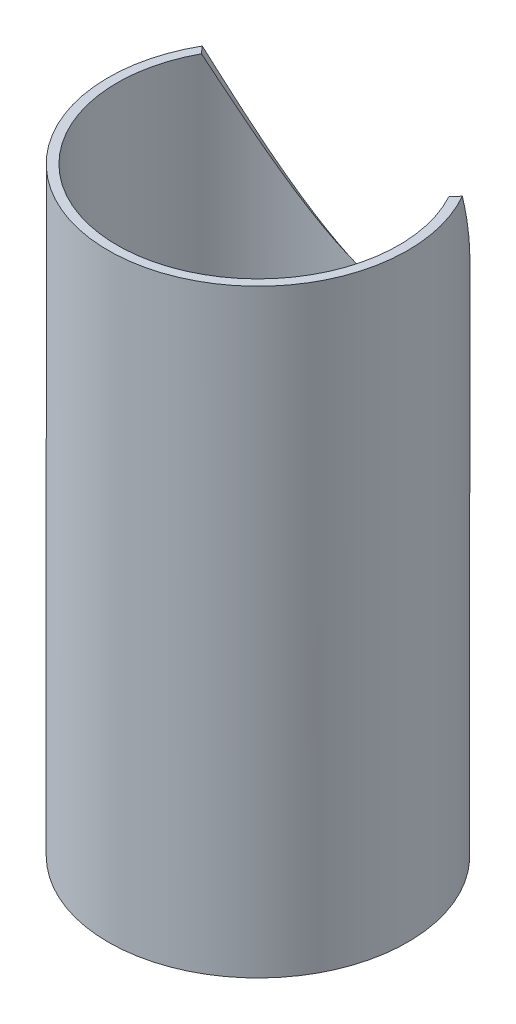
ISO-10303-21;
HEADER;
FILE_DESCRIPTION(('STEP AP214'),'2;1');
FILE_NAME('part.step','',(''),(''),'','','');
FILE_SCHEMA(('AUTOMOTIVE_DESIGN { 1 0 10303 214 1 1 1 1 }'));
ENDSEC;
DATA;
#1=APPLICATION_CONTEXT('core data for automotive mechanical design processes');
#2=APPLICATION_PROTOCOL_DEFINITION('international standard','automotive_design',2000,#1);
#3=PRODUCT_CONTEXT('',#1,'mechanical');
#4=PRODUCT('Part','Part','',(#3));
#5=PRODUCT_RELATED_PRODUCT_CATEGORY('part','',(#4));
#6=PRODUCT_DEFINITION_FORMATION('','',#4);
#7=PRODUCT_DEFINITION_CONTEXT('part definition',#1,'design');
#8=PRODUCT_DEFINITION('design','',#6,#7);
#9=PRODUCT_DEFINITION_SHAPE('','',#8);
#10=(LENGTH_UNIT() NAMED_UNIT(*) SI_UNIT(.MILLI.,.METRE.));
#11=(NAMED_UNIT(*) PLANE_ANGLE_UNIT() SI_UNIT($,.RADIAN.));
#12=(NAMED_UNIT(*) SI_UNIT($,.STERADIAN.) SOLID_ANGLE_UNIT());
#13=UNCERTAINTY_MEASURE_WITH_UNIT(LENGTH_MEASURE(1.E-05),#10,'distance_accuracy_value','');
#14=(GEOMETRIC_REPRESENTATION_CONTEXT(3) GLOBAL_UNCERTAINTY_ASSIGNED_CONTEXT((#13)) GLOBAL_UNIT_ASSIGNED_CONTEXT((#10,
#11,#12)) REPRESENTATION_CONTEXT('',''));
#15=CARTESIAN_POINT('',(0.,0.,0.));
#16=DIRECTION('',(0.,0.,1.));
#17=DIRECTION('',(1.,0.,0.));
#18=AXIS2_PLACEMENT_3D('',#15,#16,#17);
#19=CARTESIAN_POINT('',(0.,200.,0.));
#20=DIRECTION('',(0.,1.,0.));
#21=DIRECTION('',(0.,0.,1.00000000000001));
#22=AXIS2_PLACEMENT_3D('',#19,#20,#21);
#23=PLANE('',#22);
#24=CARTESIAN_POINT('',(0.,200.,-79.6979183351203));
#25=DIRECTION('',(0.,1.,0.));
#26=DIRECTION('',(0.,0.,-1.00000000000001));
#27=AXIS2_PLACEMENT_3D('',#24,#25,#26);
#28=ELLIPSE('',#27,76.2984117975911,62.5);
#29=CARTESIAN_POINT('',(-43.4115484470269,200.,-24.808012041102));
#30=VERTEX_POINT('',#29);
#31=CARTESIAN_POINT('',(-41.3011468451532,200.,-22.4324601699214));
#32=VERTEX_POINT('',#31);
#33=EDGE_CURVE('E105',#30,#32,#28,.T.);
#34=ORIENTED_EDGE('',*,*,#33,.F.);
#35=CARTESIAN_POINT('',(0.,200.,0.));
#36=DIRECTION('',(0.,1.,0.));
#37=DIRECTION('',(0.,0.,1.00000000000001));
#38=AXIS2_PLACEMENT_3D('',#35,#36,#37);
#39=CIRCLE('',#38,50.);
#40=CARTESIAN_POINT('',(43.4115484470269,200.,-24.808012041102));
#41=VERTEX_POINT('',#40);
#42=EDGE_CURVE('E100',#30,#41,#39,.T.);
#43=ORIENTED_EDGE('',*,*,#42,.T.);
#44=CARTESIAN_POINT('',(41.3011468451532,200.,-22.4324601699214));
#45=VERTEX_POINT('',#44);
#46=EDGE_CURVE('E114',#45,#41,#28,.T.);
#47=ORIENTED_EDGE('',*,*,#46,.F.);
#48=CARTESIAN_POINT('',(0.,200.,0.));
#49=DIRECTION('',(0.,1.,0.));
#50=DIRECTION('',(1.00000000000001,0.,0.));
#51=AXIS2_PLACEMENT_3D('',#48,#49,#50);
#52=CIRCLE('',#51,47.);
#53=EDGE_CURVE('E119',#32,#45,#52,.T.);
#54=ORIENTED_EDGE('',*,*,#53,.F.);
#55=EDGE_LOOP('',(#34,#43,#47,#54));
#56=FACE_BOUND('',#55,.T.);
#57=ADVANCED_FACE('F85',(#56),#23,.T.);
#58=CARTESIAN_POINT('',(0.,0.,0.));
#59=DIRECTION('',(0.,1.,0.));
#60=DIRECTION('',(0.,0.,1.00000000000001));
#61=AXIS2_PLACEMENT_3D('',#58,#59,#60);
#62=PLANE('',#61);
#63=CARTESIAN_POINT('',(0.,0.,0.));
#64=DIRECTION('',(0.,1.,0.));
#65=DIRECTION('',(0.,0.,1.00000000000001));
#66=AXIS2_PLACEMENT_3D('',#63,#64,#65);
#67=CIRCLE('',#66,50.);
#68=CARTESIAN_POINT('',(0.,0.,50.0000000000003));
#69=VERTEX_POINT('',#68);
#70=EDGE_CURVE('E124',#69,#69,#67,.T.);
#71=ORIENTED_EDGE('',*,*,#70,.F.);
#72=EDGE_LOOP('',(#71));
#73=FACE_BOUND('',#72,.T.);
#74=CARTESIAN_POINT('',(0.,0.,0.));
#75=DIRECTION('',(0.,1.,0.));
#76=DIRECTION('',(1.00000000000001,0.,0.));
#77=AXIS2_PLACEMENT_3D('',#74,#75,#76);
#78=CIRCLE('',#77,47.);
#79=CARTESIAN_POINT('',(47.0000000000003,0.,0.));
#80=VERTEX_POINT('',#79);
#81=EDGE_CURVE('E126',#80,#80,#78,.T.);
#82=ORIENTED_EDGE('',*,*,#81,.T.);
#83=EDGE_LOOP('',(#82));
#84=FACE_BOUND('',#83,.T.);
#85=ADVANCED_FACE('F143',(#73,#84),#62,.F.);
#86=CARTESIAN_POINT('',(0.,200.,0.));
#87=DIRECTION('',(0.,-1.,0.));
#88=DIRECTION('',(0.,0.,-1.00000000000001));
#89=AXIS2_PLACEMENT_3D('',#86,#87,#88);
#90=CYLINDRICAL_SURFACE('',#89,50.);
#91=ORIENTED_EDGE('',*,*,#42,.F.);
#92=CARTESIAN_POINT('',(-43.4115484470269,200.,-24.808012041102));
#93=CARTESIAN_POINT('',(-43.1882554393132,199.066140757275,-25.1987287377304));
#94=CARTESIAN_POINT('',(-42.9595070072669,198.132474550287,-25.586793609528));
#95=CARTESIAN_POINT('',(-42.4907849658919,196.265861335717,-26.3578654201332));
#96=CARTESIAN_POINT('',(-42.2508112529962,195.332914334851,-26.740872312233));
#97=CARTESIAN_POINT('',(-41.7592866971202,193.467931558747,-27.5021313140156));
#98=CARTESIAN_POINT('',(-41.50773389494,192.535895965167,-27.8803826051566));
#99=CARTESIAN_POINT('',(-40.9927025017648,190.673260710046,-28.632253100087));
#100=CARTESIAN_POINT('',(-40.7292239335742,189.742661045761,-29.0058723127322));
#101=CARTESIAN_POINT('',(-39.9173698181452,186.943620484037,-30.1240081424272));
#102=CARTESIAN_POINT('',(-39.3501851451642,185.077882892477,-30.8617502770765));
#103=CARTESIAN_POINT('',(-38.1614771975081,181.357105385439,-32.3200683169202));
#104=CARTESIAN_POINT('',(-37.5399572107515,179.502064829897,-33.0406452574554));
#105=CARTESIAN_POINT('',(-36.5553466550259,176.710218769315,-34.1167041750029));
#106=CARTESIAN_POINT('',(-36.2144900761371,175.767943410626,-34.4784246655062));
#107=CARTESIAN_POINT('',(-35.5160846540969,173.887904825823,-35.1974294653655));
#108=CARTESIAN_POINT('',(-35.1585361277089,172.950141514456,-35.5547138587427));
#109=CARTESIAN_POINT('',(-34.4256034784985,171.079710407259,-36.2648344221887));
#110=CARTESIAN_POINT('',(-34.0502164584583,170.147043466766,-36.6176698578293));
#111=CARTESIAN_POINT('',(-33.2804112339584,168.287834176211,-37.3186985581683));
#112=CARTESIAN_POINT('',(-32.8859931438043,167.361291789401,-37.6668918507327));
#113=CARTESIAN_POINT('',(-32.0775645361782,165.517364942004,-38.3576842732188));
#114=CARTESIAN_POINT('',(-31.6635985443464,164.599964934923,-38.7002939321283));
#115=CARTESIAN_POINT('',(-30.8136132332815,162.773479944601,-39.3804207706529));
#116=CARTESIAN_POINT('',(-30.3775933654769,161.864395168859,-39.7179378233222));
#117=CARTESIAN_POINT('',(-29.4817267795845,160.05634111586,-40.3873790525956));
#118=CARTESIAN_POINT('',(-29.0218877160263,159.157368700553,-40.7193049810768));
#119=CARTESIAN_POINT('',(-28.076036640401,157.371118462078,-41.3771446022524));
#120=CARTESIAN_POINT('',(-27.5900268465677,156.483839655669,-41.7030588013677));
#121=CARTESIAN_POINT('',(-26.8057584965309,155.10423866073,-42.2085919002712));
#122=CARTESIAN_POINT('',(-26.5172759533439,154.607176484242,-42.3904800203089));
#123=CARTESIAN_POINT('',(-25.9304763466678,153.618048912282,-42.751949347697));
#124=CARTESIAN_POINT('',(-25.6321594839941,153.125983415047,-42.9315306020493));
#125=CARTESIAN_POINT('',(-25.0250317472889,152.147326256315,-43.2882407764934));
#126=CARTESIAN_POINT('',(-24.716219028103,151.660735577504,-43.4653692576079));
#127=CARTESIAN_POINT('',(-24.0874868639714,150.693800360745,-43.816921564767));
#128=CARTESIAN_POINT('',(-23.7675673651563,150.213455853107,-43.9913453776876));
#129=CARTESIAN_POINT('',(-22.7905228442231,148.783569944436,-44.5099576647014));
#130=CARTESIAN_POINT('',(-22.1156531428,147.844431188567,-44.8497584297436));
#131=CARTESIAN_POINT('',(-20.7120897924734,146.001977643848,-45.5149716089889));
#132=CARTESIAN_POINT('',(-19.9834070420015,145.098655657887,-45.8403869153672));
#133=CARTESIAN_POINT('',(-18.6204669191977,143.519882479958,-46.4080265978448));
#134=CARTESIAN_POINT('',(-17.9976397779629,142.835794877963,-46.6535889947462));
#135=CARTESIAN_POINT('',(-16.7081120998314,141.504509448696,-47.1307955622664));
#136=CARTESIAN_POINT('',(-16.041402410791,140.857319369631,-47.3624368100957));
#137=CARTESIAN_POINT('',(-14.6611113857502,139.611688817277,-47.8077037226529));
#138=CARTESIAN_POINT('',(-13.9476492607085,139.013132452754,-48.0213722608563));
#139=CARTESIAN_POINT('',(-12.4680867359131,137.876728162056,-48.426587244586));
#140=CARTESIAN_POINT('',(-11.7020251665191,137.338836210702,-48.6181497352144));
#141=CARTESIAN_POINT('',(-10.4458656155274,136.549615195108,-48.8989590267108));
#142=CARTESIAN_POINT('',(-9.97405464165908,136.272391756595,-48.9975364486684));
#143=CARTESIAN_POINT('',(-9.01137664955539,135.748625407984,-49.1836908745227));
#144=CARTESIAN_POINT('',(-8.5205068773754,135.502086953591,-49.271266280856));
#145=CARTESIAN_POINT('',(-7.52065762906318,135.044469170473,-49.4337540646155));
#146=CARTESIAN_POINT('',(-7.01168648225139,134.833373782085,-49.5086721773049));
#147=CARTESIAN_POINT('',(-5.97719558195241,134.451417117686,-49.6441842762708));
#148=CARTESIAN_POINT('',(-5.45168430009001,134.280535612989,-49.7047854644135));
#149=CARTESIAN_POINT('',(-4.37984437718019,133.981677295152,-49.8107464151567));
#150=CARTESIAN_POINT('',(-3.83333778227954,133.854262558471,-49.8559065221845));
#151=CARTESIAN_POINT('',(-2.72980238466628,133.649453562329,-49.9284870028701));
#152=CARTESIAN_POINT('',(-2.17277395227277,133.57205754581,-49.9559079996682));
#153=CARTESIAN_POINT('',(-1.05375048291688,133.470108921017,-49.9920261479357));
#154=CARTESIAN_POINT('',(-0.491760223702882,133.445510085278,-50.000739679045));
#155=CARTESIAN_POINT('',(0.631952073452959,133.44996361477,-49.9991620522272));
#156=CARTESIAN_POINT('',(1.19367413189211,133.47901085398,-49.9888727100733));
#157=CARTESIAN_POINT('',(2.23250697361981,133.581825736919,-49.9524470008381));
#158=CARTESIAN_POINT('',(2.71040333468018,133.648726831928,-49.9287437742712));
#159=CARTESIAN_POINT('',(3.65861159747408,133.819494288165,-49.868228368193));
#160=CARTESIAN_POINT('',(4.12892446638006,133.923355895968,-49.8314178743833));
#161=CARTESIAN_POINT('',(5.05962305204867,134.165597017454,-49.7455402768813));
#162=CARTESIAN_POINT('',(5.52000376237366,134.303993516737,-49.6964671419292));
#163=CARTESIAN_POINT('',(6.42885423863219,134.612357594875,-49.5870903720206));
#164=CARTESIAN_POINT('',(6.87731811624116,134.782340461351,-49.5267812988977));
#165=CARTESIAN_POINT('',(7.97240488383146,135.238905670943,-49.3647316263352));
#166=CARTESIAN_POINT('',(8.61113883768006,135.542355873012,-49.256976426819));
#167=CARTESIAN_POINT('',(9.85756332585094,136.201463297243,-49.0227622839624));
#168=CARTESIAN_POINT('',(10.4652351689337,136.557151465824,-48.8962922533851));
#169=CARTESIAN_POINT('',(11.6505374011187,137.31246732524,-48.6275130722681));
#170=CARTESIAN_POINT('',(12.2281041556702,137.712182938698,-48.4851722205491));
#171=CARTESIAN_POINT('',(13.3529877673588,138.547315800412,-48.1875112844085));
#172=CARTESIAN_POINT('',(13.9003084569615,138.98272850806,-48.0321928506644));
#173=CARTESIAN_POINT('',(14.921153211929,139.844734277283,-47.7244027837899));
#174=CARTESIAN_POINT('',(15.3969920326946,140.268919121725,-47.5728156948189));
#175=CARTESIAN_POINT('',(16.3264697970649,141.138145135559,-47.2618929805358));
#176=CARTESIAN_POINT('',(16.7801095129778,141.583185578326,-47.1025576251714));
#177=CARTESIAN_POINT('',(17.6671185236541,142.491329698512,-46.7770912915047));
#178=CARTESIAN_POINT('',(18.1004710395944,142.954447766463,-46.6109548939478));
#179=CARTESIAN_POINT('',(18.94801895625,143.895812454947,-46.2728940197946));
#180=CARTESIAN_POINT('',(19.362214216173,144.374059186623,-46.1009695006758));
#181=CARTESIAN_POINT('',(20.1739195156467,145.344823043523,-45.7515978604922));
#182=CARTESIAN_POINT('',(20.5713825740639,145.837374537634,-45.5741373469089));
#183=CARTESIAN_POINT('',(21.3497536472812,146.833752088905,-45.2147294701179));
#184=CARTESIAN_POINT('',(21.7306618846716,147.337577994335,-45.0327821672896));
#185=CARTESIAN_POINT('',(22.4769601926966,148.354827437042,-44.6649666912834));
#186=CARTESIAN_POINT('',(22.8423565995092,148.868246929732,-44.4791001663567));
#187=CARTESIAN_POINT('',(23.558870649112,149.903664840187,-44.1037769027425));
#188=CARTESIAN_POINT('',(23.9099879052147,150.425663489744,-43.9143200670309));
#189=CARTESIAN_POINT('',(24.7712893194145,151.740296798952,-43.4365370705803));
#190=CARTESIAN_POINT('',(25.2731522495937,152.537651151292,-43.1461760085033));
#191=CARTESIAN_POINT('',(26.2498170612708,154.146507841688,-42.5590375633419));
#192=CARTESIAN_POINT('',(26.724615963915,154.95801172435,-42.2622594788954));
#193=CARTESIAN_POINT('',(27.6497412645434,156.593197208511,-41.662881426707));
#194=CARTESIAN_POINT('',(28.1000574243688,157.416883724139,-41.3602790939296));
#195=CARTESIAN_POINT('',(28.9780910886038,159.074265579689,-40.7499210174848));
#196=CARTESIAN_POINT('',(29.4058093330424,159.907960590759,-40.4421654430092));
#197=CARTESIAN_POINT('',(30.2412424505526,161.585459343194,-39.8213331996775));
#198=CARTESIAN_POINT('',(30.6489190937651,162.429278854092,-39.5082477866872));
#199=CARTESIAN_POINT('',(31.4450021216238,164.124304766969,-38.8776243338586));
#200=CARTESIAN_POINT('',(31.833408360852,164.975511224632,-38.5600862604429));
#201=CARTESIAN_POINT('',(32.5922378145732,166.684110084058,-37.9208663679419));
#202=CARTESIAN_POINT('',(32.9626648134805,167.541501140012,-37.5991854390739));
#203=CARTESIAN_POINT('',(33.6868135321744,169.261804448274,-36.9517839459503));
#204=CARTESIAN_POINT('',(34.0405348404033,170.12471683601,-36.626063282422));
#205=CARTESIAN_POINT('',(35.0797488768312,172.724386828768,-35.6416084492802));
#206=CARTESIAN_POINT('',(35.7416594680442,174.468374371965,-34.9769654548099));
#207=CARTESIAN_POINT('',(37.0096062554466,177.970713769413,-33.6324605422248));
#208=CARTESIAN_POINT('',(37.6156396373362,179.72906634232,-32.9525978596994));
#209=CARTESIAN_POINT('',(38.7765753241334,183.254628585982,-31.5782435594492));
#210=CARTESIAN_POINT('',(39.331528418673,185.021827575648,-30.8837673352926));
#211=CARTESIAN_POINT('',(40.3951287578617,188.563705847419,-29.4789706365718));
#212=CARTESIAN_POINT('',(40.9037787727281,190.338384675367,-28.7686511130493));
#213=CARTESIAN_POINT('',(41.5709913875073,192.7726357679,-27.7840884944673));
#214=CARTESIAN_POINT('',(41.7481631415665,193.430113358474,-27.5171420517774));
#215=CARTESIAN_POINT('',(42.0967455877688,194.745640869102,-26.9808513073518));
#216=CARTESIAN_POINT('',(42.2681561447747,195.40369080221,-26.7115069495566));
#217=CARTESIAN_POINT('',(42.6047522538625,196.717955745325,-26.17128251084));
#218=CARTESIAN_POINT('',(42.7699571972893,197.374169277307,-25.9004109039699));
#219=CARTESIAN_POINT('',(43.094858090174,198.686889862,-25.3561349770549));
#220=CARTESIAN_POINT('',(43.2545541753379,199.343396907076,-25.0827307196105));
#221=CARTESIAN_POINT('',(43.4115484470269,200.,-24.808012041102));
#222=B_SPLINE_CURVE_WITH_KNOTS('',3,(#92,#93,#94,#95,#96,#97,#98,#99,#100,#101,#102,#103,#104,
#105,#106,#107,#108,#109,#110,#111,#112,#113,#114,#115,#116,#117,#118,#119,#120,#121,#122,#123,
#124,#125,#126,#127,#128,#129,#130,#131,#132,#133,#134,#135,#136,#137,#138,#139,#140,#141,#142,
#143,#144,#145,#146,#147,#148,#149,#150,#151,#152,#153,#154,#155,#156,#157,#158,#159,#160,#161,
#162,#163,#164,#165,#166,#167,#168,#169,#170,#171,#172,#173,#174,#175,#176,#177,#178,#179,#180,
#181,#182,#183,#184,#185,#186,#187,#188,#189,#190,#191,#192,#193,#194,#195,#196,#197,#198,#199,
#200,#201,#202,#203,#204,#205,#206,#207,#208,#209,#210,#211,#212,#213,#214,#215,#216,#217,#218,
#219,#220,#221),.UNSPECIFIED.,.F.,.F.,(4,2,2,2,2,2,2,2,2,2,2,2,2,2,2,2,2,2,2,2,2,2,2,2,2,2,2,2,
2,2,2,2,2,2,2,2,2,2,2,2,2,2,2,2,2,2,2,2,2,2,2,2,2,2,2,2,2,2,2,2,2,2,2,2,4),(0.,3.10988970539728,
6.21980810901407,9.33025466394406,12.4406952713556,18.694721014745,24.9483685784333,
28.1442063110447,31.3399834207806,34.5362813547393,37.7325600932876,40.9218799857157,
44.1112792487995,47.2996598505048,50.4877706288117,52.2961024305356,54.1043973292235,
55.9130117844234,57.7216350128833,61.336136013312,64.9499069876328,67.8199532207802,
70.6905999391404,73.5541921907484,76.4156927282445,78.0827332987934,79.7500156552554,
81.4165404959705,83.0822252284192,84.768698096322,86.4551117185123,88.1400481693539,
89.8248236285265,91.2725717434612,92.7201337334007,94.168409098706,95.6173872553465,
97.7598690438203,99.9036252234254,102.051742871225,104.199587704919,106.164469913093,
108.129283714236,110.095694827521,112.062120390234,114.033742044288,116.0053371804,
117.97611906618,119.946954286356,122.903979962718,125.861330483748,128.819908340573,
131.778389250732,134.742310416488,137.706253945106,140.6695708693,143.632960759085,
149.572563883815,155.512465998119,161.446396724687,167.379972202829,169.574115774446,
171.768310777015,173.954955255987,176.141545830253),.UNSPECIFIED.);
#223=EDGE_CURVE('E106',#30,#41,#222,.T.);
#224=ORIENTED_EDGE('',*,*,#223,.T.);
#225=EDGE_LOOP('',(#91,#224));
#226=FACE_BOUND('',#225,.T.);
#227=ORIENTED_EDGE('',*,*,#70,.T.);
#228=EDGE_LOOP('',(#227));
#229=FACE_BOUND('',#228,.T.);
#230=ADVANCED_FACE('F84',(#226,#229),#90,.T.);
#231=CARTESIAN_POINT('',(0.,200.,0.));
#232=DIRECTION('',(0.,-1.,0.));
#233=DIRECTION('',(0.,0.,-1.00000000000001));
#234=AXIS2_PLACEMENT_3D('',#231,#232,#233);
#235=CYLINDRICAL_SURFACE('',#234,47.);
#236=CARTESIAN_POINT('',(-41.3011468451532,200.,-22.4324601699214));
#237=CARTESIAN_POINT('',(-41.0924322710104,199.13086440248,-22.8167069329499));
#238=CARTESIAN_POINT('',(-40.8783290281608,198.261777046562,-23.1981378491589));
#239=CARTESIAN_POINT('',(-40.4390942283774,196.524035976231,-23.9556178328808));
#240=CARTESIAN_POINT('',(-40.2139625879034,195.655382265152,-24.3316668595981));
#241=CARTESIAN_POINT('',(-39.7523863524682,193.918720293815,-25.0786866822803));
#242=CARTESIAN_POINT('',(-39.515939958286,193.050712158649,-25.4496566584546));
#243=CARTESIAN_POINT('',(-39.0314434655544,191.31584449399,-26.1866537952214));
#244=CARTESIAN_POINT('',(-38.7833933833933,190.448984962877,-26.5526809627939));
#245=CARTESIAN_POINT('',(-38.0185720895197,187.841419660871,-27.6475008731886));
#246=CARTESIAN_POINT('',(-37.483577674719,186.102976062734,-28.3690606246112));
#247=CARTESIAN_POINT('',(-36.3613376521725,182.635539359652,-29.7938870340142));
#248=CARTESIAN_POINT('',(-35.7740949868533,180.906545728335,-30.4971547192565));
#249=CARTESIAN_POINT('',(-34.8419336883614,178.300277564677,-31.5478400172577));
#250=CARTESIAN_POINT('',(-34.5181898941742,177.41805454178,-31.9018522862309));
#251=CARTESIAN_POINT('',(-33.8546598484332,175.657774870652,-32.6051505744761));
#252=CARTESIAN_POINT('',(-33.514873909969,174.779718141478,-32.954436685816));
#253=CARTESIAN_POINT('',(-32.8182043896602,173.028341552658,-33.6482864064635));
#254=CARTESIAN_POINT('',(-32.4613180400366,172.155022485463,-33.9928492396009));
#255=CARTESIAN_POINT('',(-31.7293435217266,170.414108256984,-34.6770784454052));
#256=CARTESIAN_POINT('',(-31.3542554625806,169.546513061288,-35.0167448475235));
#257=CARTESIAN_POINT('',(-30.5853824236548,167.819918513719,-35.6902651281896));
#258=CARTESIAN_POINT('',(-30.1916400930851,166.960904520679,-36.0241300866672));
#259=CARTESIAN_POINT('',(-29.3831547857623,165.250701092722,-36.6865556145859));
#260=CARTESIAN_POINT('',(-28.9684112890515,164.399511852152,-37.0151160524292));
#261=CARTESIAN_POINT('',(-28.1162819240949,162.706668980041,-37.666459994009));
#262=CARTESIAN_POINT('',(-27.6789033325819,161.865012388702,-37.9892453099749));
#263=CARTESIAN_POINT('',(-26.7793262585648,160.192739641384,-38.628645745562));
#264=CARTESIAN_POINT('',(-26.3171298714715,159.362122560684,-38.9452613830335));
#265=CARTESIAN_POINT('',(-25.5583456684538,158.048114290557,-39.4447157586284));
#266=CARTESIAN_POINT('',(-25.270574419154,157.560457546856,-39.6297564325337));
#267=CARTESIAN_POINT('',(-24.6847903231327,156.590358166534,-39.9972586658219));
#268=CARTESIAN_POINT('',(-24.3867777015346,156.107915415607,-40.179720281773));
#269=CARTESIAN_POINT('',(-23.779798116967,155.148761443591,-40.5419061509033));
#270=CARTESIAN_POINT('',(-23.4708289425413,154.672051405888,-40.7216298408774));
#271=CARTESIAN_POINT('',(-22.8412885564558,153.725229653387,-41.0780509210969));
#272=CARTESIAN_POINT('',(-22.5207172970572,153.255117965751,-41.2547482988856));
#273=CARTESIAN_POINT('',(-21.5416713277193,151.857656480048,-41.7792398280248));
#274=CARTESIAN_POINT('',(-20.8646496555294,150.941244772366,-42.1221639173909));
#275=CARTESIAN_POINT('',(-19.8068810081554,149.595574619292,-42.6243985725323));
#276=CARTESIAN_POINT('',(-19.4472750790059,149.151868374187,-42.7897752638168));
#277=CARTESIAN_POINT('',(-18.7128848097593,148.275501481626,-43.1159998462428));
#278=CARTESIAN_POINT('',(-18.3381012263262,147.84284028528,-43.2768479624749));
#279=CARTESIAN_POINT('',(-17.4031200838931,146.801939798298,-43.6633541108078));
#280=CARTESIAN_POINT('',(-16.83412025744,146.200524235201,-43.8862705392769));
#281=CARTESIAN_POINT('',(-15.6585360498297,145.03032208733,-44.3193261432182));
#282=CARTESIAN_POINT('',(-15.0519463141076,144.461540173442,-44.5294634898641));
#283=CARTESIAN_POINT('',(-13.7986113591417,143.366015612315,-44.9336312638882));
#284=CARTESIAN_POINT('',(-13.1519383125257,142.839201097664,-45.1276892504083));
#285=CARTESIAN_POINT('',(-11.8142650576905,141.837552146014,-45.496196617529));
#286=CARTESIAN_POINT('',(-11.1232899171437,141.362688717854,-45.6706569360256));
#287=CARTESIAN_POINT('',(-9.95743418947331,140.641236520056,-45.9354325125611));
#288=CARTESIAN_POINT('',(-9.4964274378146,140.374876876351,-46.0331139469475));
#289=CARTESIAN_POINT('',(-8.5557074395807,139.872607663558,-46.217200016558));
#290=CARTESIAN_POINT('',(-8.07599109211499,139.636703170209,-46.3036027720727));
#291=CARTESIAN_POINT('',(-7.09895811802302,139.200130311751,-46.4634221702997));
#292=CARTESIAN_POINT('',(-6.60165266799294,138.999440037268,-46.5368468878208));
#293=CARTESIAN_POINT('',(-5.59103915056675,138.637961400946,-46.6690449130961));
#294=CARTESIAN_POINT('',(-5.07773959475693,138.477152210431,-46.7278258689139));
#295=CARTESIAN_POINT('',(-4.03106799160993,138.198093160382,-46.8298016376384));
#296=CARTESIAN_POINT('',(-3.49752440202488,138.080405865075,-46.872790445061));
#297=CARTESIAN_POINT('',(-2.42070108584777,137.89441085981,-46.9407192808177));
#298=CARTESIAN_POINT('',(-1.87742168851492,137.826101483137,-46.9656599183541));
#299=CARTESIAN_POINT('',(-0.786634773475497,137.741407726376,-46.996581452016));
#300=CARTESIAN_POINT('',(-0.239130411190537,137.724987765536,-47.0025753399937));
#301=CARTESIAN_POINT('',(0.854776812343651,137.74461906784,-46.9954085720323));
#302=CARTESIAN_POINT('',(1.40117977403609,137.780665307329,-46.9822497499715));
#303=CARTESIAN_POINT('',(2.40532552407981,137.894507350264,-46.9406822271426));
#304=CARTESIAN_POINT('',(2.86400682771529,137.965183538939,-46.9148739331158));
#305=CARTESIAN_POINT('',(3.77379793566862,138.141510860758,-46.8504690670117));
#306=CARTESIAN_POINT('',(4.22490548591118,138.247172218777,-46.8118687562964));
#307=CARTESIAN_POINT('',(5.11705025353844,138.490992373434,-46.7227658084074));
#308=CARTESIAN_POINT('',(5.5580862661778,138.629155035731,-46.6722617554181));
#309=CARTESIAN_POINT('',(6.42838484521737,138.935114199835,-46.5603747532909));
#310=CARTESIAN_POINT('',(6.85764414386032,139.102918832397,-46.4989888192503));
#311=CARTESIAN_POINT('',(7.91794455047246,139.557167063366,-46.332735915623));
#312=CARTESIAN_POINT('',(8.5407696770546,139.860587137932,-46.2216176298012));
#313=CARTESIAN_POINT('',(9.75515798870862,140.517969123328,-45.9806547452022));
#314=CARTESIAN_POINT('',(10.3467122511263,140.871945354053,-45.8508048406397));
#315=CARTESIAN_POINT('',(11.5000295677796,141.622405438697,-45.5752301469388));
#316=CARTESIAN_POINT('',(12.0617246535415,142.018980545661,-45.4294712672489));
#317=CARTESIAN_POINT('',(13.1552154200025,142.846529631358,-45.1249650311647));
#318=CARTESIAN_POINT('',(13.6870129654762,143.277501460627,-44.9662184863591));
#319=CARTESIAN_POINT('',(14.6807254984135,144.131798117013,-44.6511534622583));
#320=CARTESIAN_POINT('',(15.1448136168021,144.55292151835,-44.4956773084765));
#321=CARTESIAN_POINT('',(16.0510245248788,145.415414581754,-44.1768645669925));
#322=CARTESIAN_POINT('',(16.4931439187294,145.856787353733,-44.0135267717038));
#323=CARTESIAN_POINT('',(17.3572257220709,146.756921510224,-43.6799876707384));
#324=CARTESIAN_POINT('',(17.7791737919493,147.215694861053,-43.5097816364613));
#325=CARTESIAN_POINT('',(18.6041279707084,148.147832197762,-43.1634861734873));
#326=CARTESIAN_POINT('',(19.0071328290427,148.621197143507,-42.9873963576786));
#327=CARTESIAN_POINT('',(19.7986384640087,149.584128157605,-42.6286776323916));
#328=CARTESIAN_POINT('',(20.1870025040702,150.073791406317,-42.4460085984913));
#329=CARTESIAN_POINT('',(20.9472135481069,151.064040143486,-42.0760374592327));
#330=CARTESIAN_POINT('',(21.3190605236679,151.564625650731,-41.888735345905));
#331=CARTESIAN_POINT('',(22.0472394983143,152.574999439111,-41.510089720444));
#332=CARTESIAN_POINT('',(22.4035796427578,153.084782684861,-41.3187484104013));
#333=CARTESIAN_POINT('',(23.1020266395008,154.112607216151,-40.9323293753624));
#334=CARTESIAN_POINT('',(23.4441332150051,154.630648662016,-40.7372515778118));
#335=CARTESIAN_POINT('',(24.3523628118622,156.042910093314,-40.2045234496877));
#336=CARTESIAN_POINT('',(24.9058096349193,156.944071450158,-39.863611589868));
#337=CARTESIAN_POINT('',(25.9782889475265,158.763486476513,-39.1731425910969));
#338=CARTESIAN_POINT('',(26.4973162455258,159.681742697841,-38.8235841588373));
#339=CARTESIAN_POINT('',(27.5046282434676,161.532694149725,-38.1165873478909));
#340=CARTESIAN_POINT('',(27.9928953204798,162.465397282686,-37.759144607679));
#341=CARTESIAN_POINT('',(28.9412432418899,164.342257568379,-37.0372715241966));
#342=CARTESIAN_POINT('',(29.4013253806232,165.286414192742,-36.6728415028134));
#343=CARTESIAN_POINT('',(30.2974080546379,167.187770660708,-35.9361195864287));
#344=CARTESIAN_POINT('',(30.7333142892248,168.145005594715,-35.5638037989274));
#345=CARTESIAN_POINT('',(31.5813113779867,170.067543349957,-34.8129496638334));
#346=CARTESIAN_POINT('',(31.9934019688015,171.032846260275,-34.4344112474886));
#347=CARTESIAN_POINT('',(32.7954219652795,172.969933012255,-33.6714496845569));
#348=CARTESIAN_POINT('',(33.1853575650962,173.941714956746,-33.2870282213022));
#349=CARTESIAN_POINT('',(33.9447001486797,175.890930029687,-32.5123285487031));
#350=CARTESIAN_POINT('',(34.3141072506674,176.868363125557,-32.1220503731033));
#351=CARTESIAN_POINT('',(35.0104758171546,178.764753712916,-31.361044769547));
#352=CARTESIAN_POINT('',(35.3386382006637,179.68341653157,-30.9906799655329));
#353=CARTESIAN_POINT('',(35.979039011472,181.52423028311,-30.2448400948552));
#354=CARTESIAN_POINT('',(36.291277124943,182.446381284355,-29.8693649276637));
#355=CARTESIAN_POINT('',(36.900625085739,184.293619888746,-29.1132210683913));
#356=CARTESIAN_POINT('',(37.1977339455857,185.218707679398,-28.7325520393608));
#357=CARTESIAN_POINT('',(37.7774759271803,187.071227749618,-27.9659303436348));
#358=CARTESIAN_POINT('',(38.0601089983283,187.998660037369,-27.5799776584766));
#359=CARTESIAN_POINT('',(38.6091077841503,189.847404659904,-26.805969190421));
#360=CARTESIAN_POINT('',(38.8755922990936,190.768701201527,-26.4179598896075));
#361=CARTESIAN_POINT('',(39.3953717055467,192.612662841572,-25.6363981775544));
#362=CARTESIAN_POINT('',(39.6486665766782,193.535327942106,-25.2428457577518));
#363=CARTESIAN_POINT('',(40.142412047645,195.381395422163,-24.4500488242004));
#364=CARTESIAN_POINT('',(40.3828654275156,196.304797597823,-24.0508055663576));
#365=CARTESIAN_POINT('',(40.8512903944286,198.152115398212,-23.2462548909638));
#366=CARTESIAN_POINT('',(41.0792620987482,199.076031018035,-22.8409475304362));
#367=CARTESIAN_POINT('',(41.3011468451532,200.,-22.4324601699214));
#368=B_SPLINE_CURVE_WITH_KNOTS('',3,(#236,#237,#238,#239,#240,#241,#242,#243,#244,#245,#246,
#247,#248,#249,#250,#251,#252,#253,#254,#255,#256,#257,#258,#259,#260,#261,#262,#263,#264,#265,
#266,#267,#268,#269,#270,#271,#272,#273,#274,#275,#276,#277,#278,#279,#280,#281,#282,#283,#284,
#285,#286,#287,#288,#289,#290,#291,#292,#293,#294,#295,#296,#297,#298,#299,#300,#301,#302,#303,
#304,#305,#306,#307,#308,#309,#310,#311,#312,#313,#314,#315,#316,#317,#318,#319,#320,#321,#322,
#323,#324,#325,#326,#327,#328,#329,#330,#331,#332,#333,#334,#335,#336,#337,#338,#339,#340,#341,
#342,#343,#344,#345,#346,#347,#348,#349,#350,#351,#352,#353,#354,#355,#356,#357,#358,#359,#360,
#361,#362,#363,#364,#365,#366,#367),.UNSPECIFIED.,.F.,.F.,(4,2,2,2,2,2,2,2,2,2,2,2,2,2,2,2,2,2,
2,2,2,2,2,2,2,2,2,2,2,2,2,2,2,2,2,2,2,2,2,2,2,2,2,2,2,2,2,2,2,2,2,2,2,2,2,2,2,2,2,2,2,2,2,2,2,
4),(0.,2.91878909100332,5.83760029526372,8.75687718807447,11.6761499579826,17.545762202943,
23.4150441022212,26.4275731007843,29.4400433290349,32.4530027971835,35.4659441351377,
38.4723013541772,41.4787330425776,44.4842041553068,47.4894219085327,49.2764293840464,
51.0633976030426,52.8507285775251,54.6380669071427,58.2055529340702,59.9890806877445,
61.7725196349356,64.3434001045097,66.9146476335358,69.4813928733959,72.0466983621263,
73.6695348677851,75.292641491685,76.9147346520656,78.5359788500452,80.1776780824177,
81.8193218978897,83.4598397880093,85.1002006083411,86.4930682749352,87.8863433852917,
89.2797842936866,90.6736080163597,92.7751655486244,94.8773195262727,96.9840699872735,
99.0906888995596,101.026901361151,102.963412189552,104.901279795166,106.839275151013,
108.792301593168,110.745331394955,112.69732261989,114.649351786772,117.98187278973,
121.314895304117,124.649810303396,127.984572038565,131.331538874055,134.678542714175,
138.024606137829,141.370650289926,144.500875421601,147.631162218498,150.761653066322,
153.892154855961,156.995787951776,160.099425842634,163.202389084962,166.305323166996),.UNSPECIFIED.);
#369=EDGE_CURVE('E60',#32,#45,#368,.T.);
#370=ORIENTED_EDGE('',*,*,#369,.F.);
#371=ORIENTED_EDGE('',*,*,#53,.T.);
#372=EDGE_LOOP('',(#370,#371));
#373=FACE_BOUND('',#372,.T.);
#374=ORIENTED_EDGE('',*,*,#81,.F.);
#375=EDGE_LOOP('',(#374));
#376=FACE_BOUND('',#375,.T.);
#377=ADVANCED_FACE('F123',(#373,#376),#235,.F.);
#378=CARTESIAN_POINT('',(0.,260.938088395403,-37.0286094765693));
#379=DIRECTION('',(0.,-0.819152044288991,-0.57357643635105));
#380=DIRECTION('',(0.,0.573576436351047,-0.819152044288997));
#381=AXIS2_PLACEMENT_3D('',#378,#379,#380);
#382=CYLINDRICAL_SURFACE('',#381,62.5);
#383=ORIENTED_EDGE('',*,*,#33,.T.);
#384=ORIENTED_EDGE('',*,*,#369,.T.);
#385=ORIENTED_EDGE('',*,*,#46,.T.);
#386=ORIENTED_EDGE('',*,*,#223,.F.);
#387=EDGE_LOOP('',(#383,#384,#385,#386));
#388=FACE_BOUND('',#387,.T.);
#389=ADVANCED_FACE('F111',(#388),#382,.F.);
#390=CLOSED_SHELL('',(#57,#85,#230,#377,#389));
#391=MANIFOLD_SOLID_BREP('B7',#390);
#392=ADVANCED_BREP_SHAPE_REPRESENTATION('',(#18,#391),#14);
#393=SHAPE_DEFINITION_REPRESENTATION(#9,#392);
ENDSEC;
END-ISO-10303-21;
